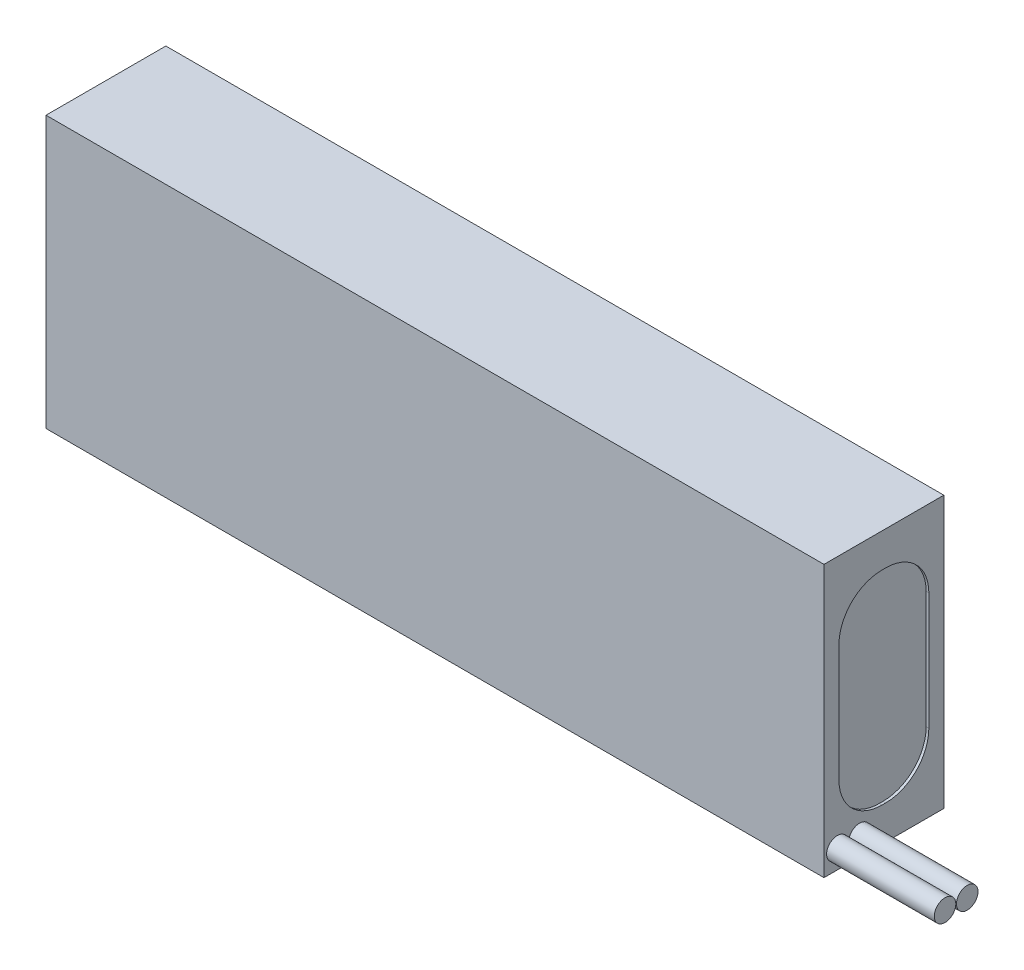
ISO-10303-21;
HEADER;
FILE_DESCRIPTION(('STEP AP214'),'2;1');
FILE_NAME('part.step','',(''),(''),'','','');
FILE_SCHEMA(('AUTOMOTIVE_DESIGN { 1 0 10303 214 1 1 1 1 }'));
ENDSEC;
DATA;
#1=APPLICATION_CONTEXT('core data for automotive mechanical design processes');
#2=APPLICATION_PROTOCOL_DEFINITION('international standard','automotive_design',2000,#1);
#3=PRODUCT_CONTEXT('',#1,'mechanical');
#4=PRODUCT('Part','Part','',(#3));
#5=PRODUCT_RELATED_PRODUCT_CATEGORY('part','',(#4));
#6=PRODUCT_DEFINITION_FORMATION('','',#4);
#7=PRODUCT_DEFINITION_CONTEXT('part definition',#1,'design');
#8=PRODUCT_DEFINITION('design','',#6,#7);
#9=PRODUCT_DEFINITION_SHAPE('','',#8);
#10=(LENGTH_UNIT() NAMED_UNIT(*) SI_UNIT(.MILLI.,.METRE.));
#11=(NAMED_UNIT(*) PLANE_ANGLE_UNIT() SI_UNIT($,.RADIAN.));
#12=(NAMED_UNIT(*) SI_UNIT($,.STERADIAN.) SOLID_ANGLE_UNIT());
#13=UNCERTAINTY_MEASURE_WITH_UNIT(LENGTH_MEASURE(1.E-05),#10,'distance_accuracy_value','');
#14=(GEOMETRIC_REPRESENTATION_CONTEXT(3) GLOBAL_UNCERTAINTY_ASSIGNED_CONTEXT((#13)) GLOBAL_UNIT_ASSIGNED_CONTEXT((#10,
#11,#12)) REPRESENTATION_CONTEXT('',''));
#15=CARTESIAN_POINT('',(0.,0.,0.));
#16=DIRECTION('',(0.,0.,1.));
#17=DIRECTION('',(1.,0.,0.));
#18=AXIS2_PLACEMENT_3D('',#15,#16,#17);
#19=CARTESIAN_POINT('',(69.,28.4,7.26));
#20=DIRECTION('',(1.,0.,0.));
#21=DIRECTION('',(0.,0.,-1.));
#22=AXIS2_PLACEMENT_3D('',#19,#20,#21);
#23=PLANE('',#22);
#24=CARTESIAN_POINT('',(69.,-18.4595652933801,4.77483042519466));
#25=DIRECTION('',(1.,0.,0.));
#26=DIRECTION('',(0.,0.,-1.));
#27=AXIS2_PLACEMENT_3D('',#24,#25,#26);
#28=CIRCLE('',#27,2.00000000000001);
#29=CARTESIAN_POINT('',(69.,-18.4595652933801,2.77483042519466));
#30=VERTEX_POINT('',#29);
#31=EDGE_CURVE('E369',#30,#30,#28,.T.);
#32=ORIENTED_EDGE('',*,*,#31,.F.);
#33=EDGE_LOOP('',(#32));
#34=FACE_BOUND('',#33,.T.);
#35=CARTESIAN_POINT('',(69.,-18.5345539660737,0.651385293316764));
#36=DIRECTION('',(1.,0.,0.));
#37=DIRECTION('',(0.,0.,-1.));
#38=AXIS2_PLACEMENT_3D('',#35,#36,#37);
#39=CIRCLE('',#38,2.00000000000001);
#40=CARTESIAN_POINT('',(69.,-18.5345539660737,-1.34861470668324));
#41=VERTEX_POINT('',#40);
#42=EDGE_CURVE('E201',#41,#41,#39,.T.);
#43=ORIENTED_EDGE('',*,*,#42,.F.);
#44=EDGE_LOOP('',(#43));
#45=FACE_BOUND('',#44,.T.);
#46=CARTESIAN_POINT('',(69.,-7.69999999999999,-3.5225));
#47=DIRECTION('',(1.,0.,0.));
#48=DIRECTION('',(0.,0.,-1.));
#49=AXIS2_PLACEMENT_3D('',#46,#47,#48);
#50=CIRCLE('',#49,8.);
#51=CARTESIAN_POINT('',(69.,-7.69999999999999,4.4775));
#52=VERTEX_POINT('',#51);
#53=CARTESIAN_POINT('',(69.,-15.7,-3.5225));
#54=VERTEX_POINT('',#53);
#55=EDGE_CURVE('E61',#52,#54,#50,.T.);
#56=ORIENTED_EDGE('',*,*,#55,.F.);
#57=DIRECTION('',(0.,-1.,0.));
#58=VECTOR('',#57,1.);
#59=CARTESIAN_POINT('',(69.,14.1,4.4775));
#60=LINE('',#59,#58);
#61=CARTESIAN_POINT('',(69.,14.1,4.4775));
#62=VERTEX_POINT('',#61);
#63=EDGE_CURVE('E252',#62,#52,#60,.T.);
#64=ORIENTED_EDGE('',*,*,#63,.F.);
#65=CARTESIAN_POINT('',(69.,14.1,-3.5225));
#66=DIRECTION('',(1.,0.,0.));
#67=DIRECTION('',(0.,0.,1.));
#68=AXIS2_PLACEMENT_3D('',#65,#66,#67);
#69=CIRCLE('',#68,8.);
#70=CARTESIAN_POINT('',(69.,22.1,-3.5225));
#71=VERTEX_POINT('',#70);
#72=EDGE_CURVE('E290',#71,#62,#69,.T.);
#73=ORIENTED_EDGE('',*,*,#72,.F.);
#74=DIRECTION('',(0.,0.,1.));
#75=VECTOR('',#74,1.);
#76=CARTESIAN_POINT('',(69.,22.1,-4.2175));
#77=LINE('',#76,#75);
#78=CARTESIAN_POINT('',(69.,22.1,-4.2175));
#79=VERTEX_POINT('',#78);
#80=EDGE_CURVE('E287',#79,#71,#77,.T.);
#81=ORIENTED_EDGE('',*,*,#80,.F.);
#82=CARTESIAN_POINT('',(69.,14.1,-4.2175));
#83=DIRECTION('',(1.,0.,0.));
#84=DIRECTION('',(0.,0.,-1.));
#85=AXIS2_PLACEMENT_3D('',#82,#83,#84);
#86=CIRCLE('',#85,8.);
#87=CARTESIAN_POINT('',(69.,14.1,-12.2175));
#88=VERTEX_POINT('',#87);
#89=EDGE_CURVE('E284',#88,#79,#86,.T.);
#90=ORIENTED_EDGE('',*,*,#89,.F.);
#91=DIRECTION('',(0.,1.,0.));
#92=VECTOR('',#91,1.);
#93=CARTESIAN_POINT('',(69.,-7.69999999999999,-12.2175));
#94=LINE('',#93,#92);
#95=CARTESIAN_POINT('',(69.,-7.69999999999999,-12.2175));
#96=VERTEX_POINT('',#95);
#97=EDGE_CURVE('E281',#96,#88,#94,.T.);
#98=ORIENTED_EDGE('',*,*,#97,.F.);
#99=CARTESIAN_POINT('',(69.,-7.69999999999999,-4.2175));
#100=DIRECTION('',(1.,0.,0.));
#101=DIRECTION('',(0.,0.,-1.));
#102=AXIS2_PLACEMENT_3D('',#99,#100,#101);
#103=CIRCLE('',#102,8.);
#104=CARTESIAN_POINT('',(69.,-15.7,-4.2175));
#105=VERTEX_POINT('',#104);
#106=EDGE_CURVE('E278',#105,#96,#103,.T.);
#107=ORIENTED_EDGE('',*,*,#106,.F.);
#108=DIRECTION('',(0.,0.,-1.));
#109=VECTOR('',#108,1.);
#110=CARTESIAN_POINT('',(69.,-15.7,-3.5225));
#111=LINE('',#110,#109);
#112=EDGE_CURVE('E275',#54,#105,#111,.T.);
#113=ORIENTED_EDGE('',*,*,#112,.F.);
#114=EDGE_LOOP('',(#56,#64,#73,#81,#90,#98,#107,#113));
#115=FACE_BOUND('',#114,.T.);
#116=DIRECTION('',(0.,-1.,0.));
#117=VECTOR('',#116,1.);
#118=CARTESIAN_POINT('',(69.,28.4,-15.));
#119=LINE('',#118,#117);
#120=CARTESIAN_POINT('',(69.,28.4,-15.));
#121=VERTEX_POINT('',#120);
#122=CARTESIAN_POINT('',(69.,-22.,-15.));
#123=VERTEX_POINT('',#122);
#124=EDGE_CURVE('E297',#121,#123,#119,.T.);
#125=ORIENTED_EDGE('',*,*,#124,.F.);
#126=DIRECTION('',(0.,0.,-1.));
#127=VECTOR('',#126,1.);
#128=CARTESIAN_POINT('',(69.,28.4,7.26));
#129=LINE('',#128,#127);
#130=CARTESIAN_POINT('',(69.,28.4,7.26));
#131=VERTEX_POINT('',#130);
#132=EDGE_CURVE('E11',#131,#121,#129,.T.);
#133=ORIENTED_EDGE('',*,*,#132,.F.);
#134=DIRECTION('',(0.,-1.,0.));
#135=VECTOR('',#134,1.);
#136=CARTESIAN_POINT('',(69.,28.4,7.26));
#137=LINE('',#136,#135);
#138=CARTESIAN_POINT('',(69.,-22.,7.26));
#139=VERTEX_POINT('',#138);
#140=EDGE_CURVE('E311',#131,#139,#137,.T.);
#141=ORIENTED_EDGE('',*,*,#140,.T.);
#142=DIRECTION('',(0.,0.,-1.));
#143=VECTOR('',#142,1.);
#144=CARTESIAN_POINT('',(69.,-22.,7.26));
#145=LINE('',#144,#143);
#146=EDGE_CURVE('E40',#139,#123,#145,.T.);
#147=ORIENTED_EDGE('',*,*,#146,.T.);
#148=EDGE_LOOP('',(#125,#133,#141,#147));
#149=FACE_BOUND('',#148,.T.);
#150=ADVANCED_FACE('F37',(#34,#45,#115,#149),#23,.T.);
#151=CARTESIAN_POINT('',(-75.5,28.4,7.26));
#152=DIRECTION('',(0.,1.,0.));
#153=DIRECTION('',(0.,0.,1.));
#154=AXIS2_PLACEMENT_3D('',#151,#152,#153);
#155=PLANE('',#154);
#156=DIRECTION('',(1.,0.,0.));
#157=VECTOR('',#156,1.);
#158=CARTESIAN_POINT('',(-75.5,28.4,-15.));
#159=LINE('',#158,#157);
#160=CARTESIAN_POINT('',(-75.5,28.4,-15.));
#161=VERTEX_POINT('',#160);
#162=EDGE_CURVE('E315',#161,#121,#159,.T.);
#163=ORIENTED_EDGE('',*,*,#162,.F.);
#164=DIRECTION('',(0.,0.,-1.));
#165=VECTOR('',#164,1.);
#166=CARTESIAN_POINT('',(-75.5,28.4,7.26));
#167=LINE('',#166,#165);
#168=CARTESIAN_POINT('',(-75.5,28.4,7.26));
#169=VERTEX_POINT('',#168);
#170=EDGE_CURVE('E45',#169,#161,#167,.T.);
#171=ORIENTED_EDGE('',*,*,#170,.F.);
#172=DIRECTION('',(1.,0.,0.));
#173=VECTOR('',#172,1.);
#174=CARTESIAN_POINT('',(-75.5,28.4,7.26));
#175=LINE('',#174,#173);
#176=EDGE_CURVE('E321',#169,#131,#175,.T.);
#177=ORIENTED_EDGE('',*,*,#176,.T.);
#178=ORIENTED_EDGE('',*,*,#132,.T.);
#179=EDGE_LOOP('',(#163,#171,#177,#178));
#180=FACE_BOUND('',#179,.T.);
#181=ADVANCED_FACE('F347',(#180),#155,.T.);
#182=CARTESIAN_POINT('',(-75.5,-22.,7.26));
#183=DIRECTION('',(-1.,0.,0.));
#184=DIRECTION('',(0.,0.,1.));
#185=AXIS2_PLACEMENT_3D('',#182,#183,#184);
#186=PLANE('',#185);
#187=CARTESIAN_POINT('',(-75.5,-7.70000000000001,-4.2175));
#188=DIRECTION('',(-1.,0.,0.));
#189=DIRECTION('',(0.,0.,1.));
#190=AXIS2_PLACEMENT_3D('',#187,#188,#189);
#191=CIRCLE('',#190,8.);
#192=CARTESIAN_POINT('',(-75.5,-7.70000000000001,-12.2175));
#193=VERTEX_POINT('',#192);
#194=CARTESIAN_POINT('',(-75.5,-15.7,-4.2175));
#195=VERTEX_POINT('',#194);
#196=EDGE_CURVE('E53',#193,#195,#191,.T.);
#197=ORIENTED_EDGE('',*,*,#196,.F.);
#198=DIRECTION('',(0.,-1.,0.));
#199=VECTOR('',#198,1.);
#200=CARTESIAN_POINT('',(-75.5,14.1,-12.2175));
#201=LINE('',#200,#199);
#202=CARTESIAN_POINT('',(-75.5,14.1,-12.2175));
#203=VERTEX_POINT('',#202);
#204=EDGE_CURVE('E195',#203,#193,#201,.T.);
#205=ORIENTED_EDGE('',*,*,#204,.F.);
#206=CARTESIAN_POINT('',(-75.5,14.1,-4.2175));
#207=DIRECTION('',(-1.,0.,0.));
#208=DIRECTION('',(0.,0.,1.));
#209=AXIS2_PLACEMENT_3D('',#206,#207,#208);
#210=CIRCLE('',#209,8.);
#211=CARTESIAN_POINT('',(-75.5,22.1,-4.2175));
#212=VERTEX_POINT('',#211);
#213=EDGE_CURVE('E198',#212,#203,#210,.T.);
#214=ORIENTED_EDGE('',*,*,#213,.F.);
#215=DIRECTION('',(0.,0.,-1.));
#216=VECTOR('',#215,1.);
#217=CARTESIAN_POINT('',(-75.5,22.1,-3.5225));
#218=LINE('',#217,#216);
#219=CARTESIAN_POINT('',(-75.5,22.1,-3.5225));
#220=VERTEX_POINT('',#219);
#221=EDGE_CURVE('E230',#220,#212,#218,.T.);
#222=ORIENTED_EDGE('',*,*,#221,.F.);
#223=CARTESIAN_POINT('',(-75.5,14.1,-3.5225));
#224=DIRECTION('',(-1.,0.,0.));
#225=DIRECTION('',(0.,0.,-1.));
#226=AXIS2_PLACEMENT_3D('',#223,#224,#225);
#227=CIRCLE('',#226,8.);
#228=CARTESIAN_POINT('',(-75.5,14.1,4.4775));
#229=VERTEX_POINT('',#228);
#230=EDGE_CURVE('E227',#229,#220,#227,.T.);
#231=ORIENTED_EDGE('',*,*,#230,.F.);
#232=DIRECTION('',(0.,1.,0.));
#233=VECTOR('',#232,1.);
#234=CARTESIAN_POINT('',(-75.5,-7.70000000000001,4.4775));
#235=LINE('',#234,#233);
#236=CARTESIAN_POINT('',(-75.5,-7.70000000000001,4.4775));
#237=VERTEX_POINT('',#236);
#238=EDGE_CURVE('E224',#237,#229,#235,.T.);
#239=ORIENTED_EDGE('',*,*,#238,.F.);
#240=CARTESIAN_POINT('',(-75.5,-7.70000000000001,-3.5225));
#241=DIRECTION('',(-1.,0.,0.));
#242=DIRECTION('',(0.,0.,1.));
#243=AXIS2_PLACEMENT_3D('',#240,#241,#242);
#244=CIRCLE('',#243,8.);
#245=CARTESIAN_POINT('',(-75.5,-15.7,-3.5225));
#246=VERTEX_POINT('',#245);
#247=EDGE_CURVE('E221',#246,#237,#244,.T.);
#248=ORIENTED_EDGE('',*,*,#247,.F.);
#249=DIRECTION('',(0.,0.,1.));
#250=VECTOR('',#249,1.);
#251=CARTESIAN_POINT('',(-75.5,-15.7,-4.2175));
#252=LINE('',#251,#250);
#253=EDGE_CURVE('E218',#195,#246,#252,.T.);
#254=ORIENTED_EDGE('',*,*,#253,.F.);
#255=EDGE_LOOP('',(#197,#205,#214,#222,#231,#239,#248,#254));
#256=FACE_BOUND('',#255,.T.);
#257=DIRECTION('',(0.,1.,0.));
#258=VECTOR('',#257,1.);
#259=CARTESIAN_POINT('',(-75.5,-22.,-15.));
#260=LINE('',#259,#258);
#261=CARTESIAN_POINT('',(-75.5,-22.,-15.));
#262=VERTEX_POINT('',#261);
#263=EDGE_CURVE('E329',#262,#161,#260,.T.);
#264=ORIENTED_EDGE('',*,*,#263,.F.);
#265=DIRECTION('',(0.,0.,-1.));
#266=VECTOR('',#265,1.);
#267=CARTESIAN_POINT('',(-75.5,-22.,7.26));
#268=LINE('',#267,#266);
#269=CARTESIAN_POINT('',(-75.5,-22.,7.26));
#270=VERTEX_POINT('',#269);
#271=EDGE_CURVE('E334',#270,#262,#268,.T.);
#272=ORIENTED_EDGE('',*,*,#271,.F.);
#273=DIRECTION('',(0.,1.,0.));
#274=VECTOR('',#273,1.);
#275=CARTESIAN_POINT('',(-75.5,-22.,7.26));
#276=LINE('',#275,#274);
#277=EDGE_CURVE('E318',#270,#169,#276,.T.);
#278=ORIENTED_EDGE('',*,*,#277,.T.);
#279=ORIENTED_EDGE('',*,*,#170,.T.);
#280=EDGE_LOOP('',(#264,#272,#278,#279));
#281=FACE_BOUND('',#280,.T.);
#282=ADVANCED_FACE('F353',(#256,#281),#186,.T.);
#283=CARTESIAN_POINT('',(69.,-22.,7.26));
#284=DIRECTION('',(0.,-1.,0.));
#285=DIRECTION('',(0.,0.,-1.));
#286=AXIS2_PLACEMENT_3D('',#283,#284,#285);
#287=PLANE('',#286);
#288=DIRECTION('',(-1.,0.,0.));
#289=VECTOR('',#288,1.);
#290=CARTESIAN_POINT('',(69.,-22.,-15.));
#291=LINE('',#290,#289);
#292=EDGE_CURVE('E326',#123,#262,#291,.T.);
#293=ORIENTED_EDGE('',*,*,#292,.F.);
#294=ORIENTED_EDGE('',*,*,#146,.F.);
#295=DIRECTION('',(-1.,0.,0.));
#296=VECTOR('',#295,1.);
#297=CARTESIAN_POINT('',(69.,-22.,7.26));
#298=LINE('',#297,#296);
#299=EDGE_CURVE('E314',#139,#270,#298,.T.);
#300=ORIENTED_EDGE('',*,*,#299,.T.);
#301=ORIENTED_EDGE('',*,*,#271,.T.);
#302=EDGE_LOOP('',(#293,#294,#300,#301));
#303=FACE_BOUND('',#302,.T.);
#304=ADVANCED_FACE('F342',(#303),#287,.T.);
#305=CARTESIAN_POINT('',(0.,0.,7.26));
#306=DIRECTION('',(0.,0.,-1.));
#307=DIRECTION('',(-1.,0.,0.));
#308=AXIS2_PLACEMENT_3D('',#305,#306,#307);
#309=PLANE('',#308);
#310=ORIENTED_EDGE('',*,*,#140,.F.);
#311=ORIENTED_EDGE('',*,*,#176,.F.);
#312=ORIENTED_EDGE('',*,*,#277,.F.);
#313=ORIENTED_EDGE('',*,*,#299,.F.);
#314=EDGE_LOOP('',(#310,#311,#312,#313));
#315=FACE_BOUND('',#314,.T.);
#316=ADVANCED_FACE('F350',(#315),#309,.F.);
#317=CARTESIAN_POINT('',(0.,0.,-15.));
#318=DIRECTION('',(0.,0.,-1.));
#319=DIRECTION('',(-1.,0.,0.));
#320=AXIS2_PLACEMENT_3D('',#317,#318,#319);
#321=PLANE('',#320);
#322=ORIENTED_EDGE('',*,*,#124,.T.);
#323=ORIENTED_EDGE('',*,*,#292,.T.);
#324=ORIENTED_EDGE('',*,*,#263,.T.);
#325=ORIENTED_EDGE('',*,*,#162,.T.);
#326=EDGE_LOOP('',(#322,#323,#324,#325));
#327=FACE_BOUND('',#326,.T.);
#328=ADVANCED_FACE('F344',(#327),#321,.T.);
#329=CARTESIAN_POINT('',(68.5,-7.69999999999999,-3.5225));
#330=DIRECTION('',(1.,0.,0.));
#331=DIRECTION('',(0.,0.,-1.));
#332=AXIS2_PLACEMENT_3D('',#329,#330,#331);
#333=CYLINDRICAL_SURFACE('',#332,8.);
#334=ORIENTED_EDGE('',*,*,#55,.T.);
#335=DIRECTION('',(1.,0.,0.));
#336=VECTOR('',#335,1.);
#337=CARTESIAN_POINT('',(68.5,-15.7,-3.5225));
#338=LINE('',#337,#336);
#339=CARTESIAN_POINT('',(68.5,-15.7,-3.5225));
#340=VERTEX_POINT('',#339);
#341=EDGE_CURVE('E273',#340,#54,#338,.T.);
#342=ORIENTED_EDGE('',*,*,#341,.F.);
#343=CARTESIAN_POINT('',(68.5,-7.69999999999999,-3.5225));
#344=DIRECTION('',(1.,0.,0.));
#345=DIRECTION('',(0.,0.,-1.));
#346=AXIS2_PLACEMENT_3D('',#343,#344,#345);
#347=CIRCLE('',#346,8.);
#348=CARTESIAN_POINT('',(68.5,-7.69999999999999,4.4775));
#349=VERTEX_POINT('',#348);
#350=EDGE_CURVE('E248',#349,#340,#347,.T.);
#351=ORIENTED_EDGE('',*,*,#350,.F.);
#352=DIRECTION('',(1.,0.,0.));
#353=VECTOR('',#352,1.);
#354=CARTESIAN_POINT('',(68.5,-7.69999999999999,4.4775));
#355=LINE('',#354,#353);
#356=EDGE_CURVE('E295',#349,#52,#355,.T.);
#357=ORIENTED_EDGE('',*,*,#356,.T.);
#358=EDGE_LOOP('',(#334,#342,#351,#357));
#359=FACE_BOUND('',#358,.T.);
#360=ADVANCED_FACE('F383',(#359),#333,.F.);
#361=CARTESIAN_POINT('',(68.5,14.1,4.4775));
#362=DIRECTION('',(0.,0.,1.));
#363=DIRECTION('',(1.,0.,0.));
#364=AXIS2_PLACEMENT_3D('',#361,#362,#363);
#365=PLANE('',#364);
#366=ORIENTED_EDGE('',*,*,#63,.T.);
#367=ORIENTED_EDGE('',*,*,#356,.F.);
#368=DIRECTION('',(0.,-1.,0.));
#369=VECTOR('',#368,1.);
#370=CARTESIAN_POINT('',(68.5,14.1,4.4775));
#371=LINE('',#370,#369);
#372=CARTESIAN_POINT('',(68.5,14.1,4.4775));
#373=VERTEX_POINT('',#372);
#374=EDGE_CURVE('E270',#373,#349,#371,.T.);
#375=ORIENTED_EDGE('',*,*,#374,.F.);
#376=DIRECTION('',(1.,0.,0.));
#377=VECTOR('',#376,1.);
#378=CARTESIAN_POINT('',(68.5,14.1,4.4775));
#379=LINE('',#378,#377);
#380=EDGE_CURVE('E298',#373,#62,#379,.T.);
#381=ORIENTED_EDGE('',*,*,#380,.T.);
#382=EDGE_LOOP('',(#366,#367,#375,#381));
#383=FACE_BOUND('',#382,.T.);
#384=ADVANCED_FACE('F389',(#383),#365,.F.);
#385=CARTESIAN_POINT('',(68.5,14.1,-3.5225));
#386=DIRECTION('',(1.,0.,0.));
#387=DIRECTION('',(0.,0.,-1.));
#388=AXIS2_PLACEMENT_3D('',#385,#386,#387);
#389=CYLINDRICAL_SURFACE('',#388,8.);
#390=ORIENTED_EDGE('',*,*,#72,.T.);
#391=ORIENTED_EDGE('',*,*,#380,.F.);
#392=CARTESIAN_POINT('',(68.5,14.1,-3.5225));
#393=DIRECTION('',(1.,0.,0.));
#394=DIRECTION('',(0.,0.,1.));
#395=AXIS2_PLACEMENT_3D('',#392,#393,#394);
#396=CIRCLE('',#395,8.);
#397=CARTESIAN_POINT('',(68.5,22.1,-3.5225));
#398=VERTEX_POINT('',#397);
#399=EDGE_CURVE('E267',#398,#373,#396,.T.);
#400=ORIENTED_EDGE('',*,*,#399,.F.);
#401=DIRECTION('',(1.,0.,0.));
#402=VECTOR('',#401,1.);
#403=CARTESIAN_POINT('',(68.5,22.1,-3.5225));
#404=LINE('',#403,#402);
#405=EDGE_CURVE('E300',#398,#71,#404,.T.);
#406=ORIENTED_EDGE('',*,*,#405,.T.);
#407=EDGE_LOOP('',(#390,#391,#400,#406));
#408=FACE_BOUND('',#407,.T.);
#409=ADVANCED_FACE('F391',(#408),#389,.F.);
#410=CARTESIAN_POINT('',(68.5,22.1,-4.2175));
#411=DIRECTION('',(0.,1.,0.));
#412=DIRECTION('',(0.,0.,1.));
#413=AXIS2_PLACEMENT_3D('',#410,#411,#412);
#414=PLANE('',#413);
#415=ORIENTED_EDGE('',*,*,#80,.T.);
#416=ORIENTED_EDGE('',*,*,#405,.F.);
#417=DIRECTION('',(0.,0.,1.));
#418=VECTOR('',#417,1.);
#419=CARTESIAN_POINT('',(68.5,22.1,-4.2175));
#420=LINE('',#419,#418);
#421=CARTESIAN_POINT('',(68.5,22.1,-4.2175));
#422=VERTEX_POINT('',#421);
#423=EDGE_CURVE('E264',#422,#398,#420,.T.);
#424=ORIENTED_EDGE('',*,*,#423,.F.);
#425=DIRECTION('',(1.,0.,0.));
#426=VECTOR('',#425,1.);
#427=CARTESIAN_POINT('',(68.5,22.1,-4.2175));
#428=LINE('',#427,#426);
#429=EDGE_CURVE('E302',#422,#79,#428,.T.);
#430=ORIENTED_EDGE('',*,*,#429,.T.);
#431=EDGE_LOOP('',(#415,#416,#424,#430));
#432=FACE_BOUND('',#431,.T.);
#433=ADVANCED_FACE('F395',(#432),#414,.F.);
#434=CARTESIAN_POINT('',(68.5,14.1,-4.2175));
#435=DIRECTION('',(1.,0.,0.));
#436=DIRECTION('',(0.,0.,-1.));
#437=AXIS2_PLACEMENT_3D('',#434,#435,#436);
#438=CYLINDRICAL_SURFACE('',#437,8.);
#439=ORIENTED_EDGE('',*,*,#89,.T.);
#440=ORIENTED_EDGE('',*,*,#429,.F.);
#441=CARTESIAN_POINT('',(68.5,14.1,-4.2175));
#442=DIRECTION('',(1.,0.,0.));
#443=DIRECTION('',(0.,0.,-1.));
#444=AXIS2_PLACEMENT_3D('',#441,#442,#443);
#445=CIRCLE('',#444,8.);
#446=CARTESIAN_POINT('',(68.5,14.1,-12.2175));
#447=VERTEX_POINT('',#446);
#448=EDGE_CURVE('E261',#447,#422,#445,.T.);
#449=ORIENTED_EDGE('',*,*,#448,.F.);
#450=DIRECTION('',(1.,0.,0.));
#451=VECTOR('',#450,1.);
#452=CARTESIAN_POINT('',(68.5,14.1,-12.2175));
#453=LINE('',#452,#451);
#454=EDGE_CURVE('E304',#447,#88,#453,.T.);
#455=ORIENTED_EDGE('',*,*,#454,.T.);
#456=EDGE_LOOP('',(#439,#440,#449,#455));
#457=FACE_BOUND('',#456,.T.);
#458=ADVANCED_FACE('F399',(#457),#438,.F.);
#459=CARTESIAN_POINT('',(68.5,-7.69999999999999,-12.2175));
#460=DIRECTION('',(0.,0.,-1.));
#461=DIRECTION('',(-1.,0.,0.));
#462=AXIS2_PLACEMENT_3D('',#459,#460,#461);
#463=PLANE('',#462);
#464=ORIENTED_EDGE('',*,*,#97,.T.);
#465=ORIENTED_EDGE('',*,*,#454,.F.);
#466=DIRECTION('',(0.,1.,0.));
#467=VECTOR('',#466,1.);
#468=CARTESIAN_POINT('',(68.5,-7.69999999999999,-12.2175));
#469=LINE('',#468,#467);
#470=CARTESIAN_POINT('',(68.5,-7.69999999999999,-12.2175));
#471=VERTEX_POINT('',#470);
#472=EDGE_CURVE('E258',#471,#447,#469,.T.);
#473=ORIENTED_EDGE('',*,*,#472,.F.);
#474=DIRECTION('',(1.,0.,0.));
#475=VECTOR('',#474,1.);
#476=CARTESIAN_POINT('',(68.5,-7.69999999999999,-12.2175));
#477=LINE('',#476,#475);
#478=EDGE_CURVE('E306',#471,#96,#477,.T.);
#479=ORIENTED_EDGE('',*,*,#478,.T.);
#480=EDGE_LOOP('',(#464,#465,#473,#479));
#481=FACE_BOUND('',#480,.T.);
#482=ADVANCED_FACE('F402',(#481),#463,.F.);
#483=CARTESIAN_POINT('',(68.5,-7.69999999999999,-4.2175));
#484=DIRECTION('',(1.,0.,0.));
#485=DIRECTION('',(0.,0.,-1.));
#486=AXIS2_PLACEMENT_3D('',#483,#484,#485);
#487=CYLINDRICAL_SURFACE('',#486,8.);
#488=ORIENTED_EDGE('',*,*,#106,.T.);
#489=ORIENTED_EDGE('',*,*,#478,.F.);
#490=CARTESIAN_POINT('',(68.5,-7.69999999999999,-4.2175));
#491=DIRECTION('',(1.,0.,0.));
#492=DIRECTION('',(0.,0.,-1.));
#493=AXIS2_PLACEMENT_3D('',#490,#491,#492);
#494=CIRCLE('',#493,8.);
#495=CARTESIAN_POINT('',(68.5,-15.7,-4.2175));
#496=VERTEX_POINT('',#495);
#497=EDGE_CURVE('E255',#496,#471,#494,.T.);
#498=ORIENTED_EDGE('',*,*,#497,.F.);
#499=DIRECTION('',(1.,0.,0.));
#500=VECTOR('',#499,1.);
#501=CARTESIAN_POINT('',(68.5,-15.7,-4.2175));
#502=LINE('',#501,#500);
#503=EDGE_CURVE('E308',#496,#105,#502,.T.);
#504=ORIENTED_EDGE('',*,*,#503,.T.);
#505=EDGE_LOOP('',(#488,#489,#498,#504));
#506=FACE_BOUND('',#505,.T.);
#507=ADVANCED_FACE('F404',(#506),#487,.F.);
#508=CARTESIAN_POINT('',(68.5,-15.7,-3.5225));
#509=DIRECTION('',(0.,-1.,0.));
#510=DIRECTION('',(0.,0.,-1.));
#511=AXIS2_PLACEMENT_3D('',#508,#509,#510);
#512=PLANE('',#511);
#513=ORIENTED_EDGE('',*,*,#112,.T.);
#514=ORIENTED_EDGE('',*,*,#503,.F.);
#515=DIRECTION('',(0.,0.,-1.));
#516=VECTOR('',#515,1.);
#517=CARTESIAN_POINT('',(68.5,-15.7,-3.5225));
#518=LINE('',#517,#516);
#519=EDGE_CURVE('E251',#340,#496,#518,.T.);
#520=ORIENTED_EDGE('',*,*,#519,.F.);
#521=ORIENTED_EDGE('',*,*,#341,.T.);
#522=EDGE_LOOP('',(#513,#514,#520,#521));
#523=FACE_BOUND('',#522,.T.);
#524=ADVANCED_FACE('F379',(#523),#512,.F.);
#525=CARTESIAN_POINT('',(68.5,-7.69999999999999,-3.5225));
#526=DIRECTION('',(1.,0.,0.));
#527=DIRECTION('',(0.,0.,-1.));
#528=AXIS2_PLACEMENT_3D('',#525,#526,#527);
#529=PLANE('',#528);
#530=ORIENTED_EDGE('',*,*,#350,.T.);
#531=ORIENTED_EDGE('',*,*,#519,.T.);
#532=ORIENTED_EDGE('',*,*,#497,.T.);
#533=ORIENTED_EDGE('',*,*,#472,.T.);
#534=ORIENTED_EDGE('',*,*,#448,.T.);
#535=ORIENTED_EDGE('',*,*,#423,.T.);
#536=ORIENTED_EDGE('',*,*,#399,.T.);
#537=ORIENTED_EDGE('',*,*,#374,.T.);
#538=EDGE_LOOP('',(#530,#531,#532,#533,#534,#535,#536,#537));
#539=FACE_BOUND('',#538,.T.);
#540=ADVANCED_FACE('F386',(#539),#529,.T.);
#541=CARTESIAN_POINT('',(-75.,-7.70000000000001,-4.2175));
#542=DIRECTION('',(-1.,0.,0.));
#543=DIRECTION('',(0.,0.,1.));
#544=AXIS2_PLACEMENT_3D('',#541,#542,#543);
#545=CYLINDRICAL_SURFACE('',#544,8.);
#546=ORIENTED_EDGE('',*,*,#196,.T.);
#547=DIRECTION('',(-1.,0.,0.));
#548=VECTOR('',#547,1.);
#549=CARTESIAN_POINT('',(-75.,-15.7,-4.2175));
#550=LINE('',#549,#548);
#551=CARTESIAN_POINT('',(-75.,-15.7,-4.2175));
#552=VERTEX_POINT('',#551);
#553=EDGE_CURVE('E172',#552,#195,#550,.T.);
#554=ORIENTED_EDGE('',*,*,#553,.F.);
#555=CARTESIAN_POINT('',(-75.,-7.70000000000001,-4.2175));
#556=DIRECTION('',(-1.,0.,0.));
#557=DIRECTION('',(0.,0.,1.));
#558=AXIS2_PLACEMENT_3D('',#555,#556,#557);
#559=CIRCLE('',#558,8.);
#560=CARTESIAN_POINT('',(-75.,-7.70000000000001,-12.2175));
#561=VERTEX_POINT('',#560);
#562=EDGE_CURVE('E176',#561,#552,#559,.T.);
#563=ORIENTED_EDGE('',*,*,#562,.F.);
#564=DIRECTION('',(-1.,0.,0.));
#565=VECTOR('',#564,1.);
#566=CARTESIAN_POINT('',(-75.,-7.70000000000001,-12.2175));
#567=LINE('',#566,#565);
#568=EDGE_CURVE('E235',#561,#193,#567,.T.);
#569=ORIENTED_EDGE('',*,*,#568,.T.);
#570=EDGE_LOOP('',(#546,#554,#563,#569));
#571=FACE_BOUND('',#570,.T.);
#572=ADVANCED_FACE('F174',(#571),#545,.F.);
#573=CARTESIAN_POINT('',(-75.,14.1,-12.2175));
#574=DIRECTION('',(0.,0.,-1.));
#575=DIRECTION('',(-1.,0.,0.));
#576=AXIS2_PLACEMENT_3D('',#573,#574,#575);
#577=PLANE('',#576);
#578=ORIENTED_EDGE('',*,*,#204,.T.);
#579=ORIENTED_EDGE('',*,*,#568,.F.);
#580=DIRECTION('',(0.,-1.,0.));
#581=VECTOR('',#580,1.);
#582=CARTESIAN_POINT('',(-75.,14.1,-12.2175));
#583=LINE('',#582,#581);
#584=CARTESIAN_POINT('',(-75.,14.1,-12.2175));
#585=VERTEX_POINT('',#584);
#586=EDGE_CURVE('E182',#585,#561,#583,.T.);
#587=ORIENTED_EDGE('',*,*,#586,.F.);
#588=DIRECTION('',(-1.,0.,0.));
#589=VECTOR('',#588,1.);
#590=CARTESIAN_POINT('',(-75.,14.1,-12.2175));
#591=LINE('',#590,#589);
#592=EDGE_CURVE('E237',#585,#203,#591,.T.);
#593=ORIENTED_EDGE('',*,*,#592,.T.);
#594=EDGE_LOOP('',(#578,#579,#587,#593));
#595=FACE_BOUND('',#594,.T.);
#596=ADVANCED_FACE('F490',(#595),#577,.F.);
#597=CARTESIAN_POINT('',(-75.,14.1,-4.2175));
#598=DIRECTION('',(-1.,0.,0.));
#599=DIRECTION('',(0.,0.,1.));
#600=AXIS2_PLACEMENT_3D('',#597,#598,#599);
#601=CYLINDRICAL_SURFACE('',#600,8.);
#602=ORIENTED_EDGE('',*,*,#213,.T.);
#603=ORIENTED_EDGE('',*,*,#592,.F.);
#604=CARTESIAN_POINT('',(-75.,14.1,-4.2175));
#605=DIRECTION('',(-1.,0.,0.));
#606=DIRECTION('',(0.,0.,1.));
#607=AXIS2_PLACEMENT_3D('',#604,#605,#606);
#608=CIRCLE('',#607,8.);
#609=CARTESIAN_POINT('',(-75.,22.1,-4.2175));
#610=VERTEX_POINT('',#609);
#611=EDGE_CURVE('E214',#610,#585,#608,.T.);
#612=ORIENTED_EDGE('',*,*,#611,.F.);
#613=DIRECTION('',(-1.,0.,0.));
#614=VECTOR('',#613,1.);
#615=CARTESIAN_POINT('',(-75.,22.1,-4.2175));
#616=LINE('',#615,#614);
#617=EDGE_CURVE('E239',#610,#212,#616,.T.);
#618=ORIENTED_EDGE('',*,*,#617,.T.);
#619=EDGE_LOOP('',(#602,#603,#612,#618));
#620=FACE_BOUND('',#619,.T.);
#621=ADVANCED_FACE('F499',(#620),#601,.F.);
#622=CARTESIAN_POINT('',(-75.,22.1,-3.5225));
#623=DIRECTION('',(0.,1.,0.));
#624=DIRECTION('',(0.,0.,1.));
#625=AXIS2_PLACEMENT_3D('',#622,#623,#624);
#626=PLANE('',#625);
#627=ORIENTED_EDGE('',*,*,#221,.T.);
#628=ORIENTED_EDGE('',*,*,#617,.F.);
#629=DIRECTION('',(0.,0.,-1.));
#630=VECTOR('',#629,1.);
#631=CARTESIAN_POINT('',(-75.,22.1,-3.5225));
#632=LINE('',#631,#630);
#633=CARTESIAN_POINT('',(-75.,22.1,-3.5225));
#634=VERTEX_POINT('',#633);
#635=EDGE_CURVE('E211',#634,#610,#632,.T.);
#636=ORIENTED_EDGE('',*,*,#635,.F.);
#637=DIRECTION('',(-1.,0.,0.));
#638=VECTOR('',#637,1.);
#639=CARTESIAN_POINT('',(-75.,22.1,-3.5225));
#640=LINE('',#639,#638);
#641=EDGE_CURVE('E241',#634,#220,#640,.T.);
#642=ORIENTED_EDGE('',*,*,#641,.T.);
#643=EDGE_LOOP('',(#627,#628,#636,#642));
#644=FACE_BOUND('',#643,.T.);
#645=ADVANCED_FACE('F509',(#644),#626,.F.);
#646=CARTESIAN_POINT('',(-75.,14.1,-3.5225));
#647=DIRECTION('',(-1.,0.,0.));
#648=DIRECTION('',(0.,0.,1.));
#649=AXIS2_PLACEMENT_3D('',#646,#647,#648);
#650=CYLINDRICAL_SURFACE('',#649,8.);
#651=ORIENTED_EDGE('',*,*,#230,.T.);
#652=ORIENTED_EDGE('',*,*,#641,.F.);
#653=CARTESIAN_POINT('',(-75.,14.1,-3.5225));
#654=DIRECTION('',(-1.,0.,0.));
#655=DIRECTION('',(0.,0.,-1.));
#656=AXIS2_PLACEMENT_3D('',#653,#654,#655);
#657=CIRCLE('',#656,8.);
#658=CARTESIAN_POINT('',(-75.,14.1,4.4775));
#659=VERTEX_POINT('',#658);
#660=EDGE_CURVE('E208',#659,#634,#657,.T.);
#661=ORIENTED_EDGE('',*,*,#660,.F.);
#662=DIRECTION('',(-1.,0.,0.));
#663=VECTOR('',#662,1.);
#664=CARTESIAN_POINT('',(-75.,14.1,4.4775));
#665=LINE('',#664,#663);
#666=EDGE_CURVE('E243',#659,#229,#665,.T.);
#667=ORIENTED_EDGE('',*,*,#666,.T.);
#668=EDGE_LOOP('',(#651,#652,#661,#667));
#669=FACE_BOUND('',#668,.T.);
#670=ADVANCED_FACE('F519',(#669),#650,.F.);
#671=CARTESIAN_POINT('',(-75.,-7.70000000000001,4.4775));
#672=DIRECTION('',(0.,0.,1.));
#673=DIRECTION('',(1.,0.,0.));
#674=AXIS2_PLACEMENT_3D('',#671,#672,#673);
#675=PLANE('',#674);
#676=ORIENTED_EDGE('',*,*,#238,.T.);
#677=ORIENTED_EDGE('',*,*,#666,.F.);
#678=DIRECTION('',(0.,1.,0.));
#679=VECTOR('',#678,1.);
#680=CARTESIAN_POINT('',(-75.,-7.70000000000001,4.4775));
#681=LINE('',#680,#679);
#682=CARTESIAN_POINT('',(-75.,-7.70000000000001,4.4775));
#683=VERTEX_POINT('',#682);
#684=EDGE_CURVE('E205',#683,#659,#681,.T.);
#685=ORIENTED_EDGE('',*,*,#684,.F.);
#686=DIRECTION('',(-1.,0.,0.));
#687=VECTOR('',#686,1.);
#688=CARTESIAN_POINT('',(-75.,-7.70000000000001,4.4775));
#689=LINE('',#688,#687);
#690=EDGE_CURVE('E245',#683,#237,#689,.T.);
#691=ORIENTED_EDGE('',*,*,#690,.T.);
#692=EDGE_LOOP('',(#676,#677,#685,#691));
#693=FACE_BOUND('',#692,.T.);
#694=ADVANCED_FACE('F529',(#693),#675,.F.);
#695=CARTESIAN_POINT('',(-75.,-7.70000000000001,-3.5225));
#696=DIRECTION('',(-1.,0.,0.));
#697=DIRECTION('',(0.,0.,1.));
#698=AXIS2_PLACEMENT_3D('',#695,#696,#697);
#699=CYLINDRICAL_SURFACE('',#698,8.);
#700=ORIENTED_EDGE('',*,*,#247,.T.);
#701=ORIENTED_EDGE('',*,*,#690,.F.);
#702=CARTESIAN_POINT('',(-75.,-7.70000000000001,-3.5225));
#703=DIRECTION('',(-1.,0.,0.));
#704=DIRECTION('',(0.,0.,1.));
#705=AXIS2_PLACEMENT_3D('',#702,#703,#704);
#706=CIRCLE('',#705,8.);
#707=CARTESIAN_POINT('',(-75.,-15.7,-3.5225));
#708=VERTEX_POINT('',#707);
#709=EDGE_CURVE('E190',#708,#683,#706,.T.);
#710=ORIENTED_EDGE('',*,*,#709,.F.);
#711=DIRECTION('',(-1.,0.,0.));
#712=VECTOR('',#711,1.);
#713=CARTESIAN_POINT('',(-75.,-15.7,-3.5225));
#714=LINE('',#713,#712);
#715=EDGE_CURVE('E181',#708,#246,#714,.T.);
#716=ORIENTED_EDGE('',*,*,#715,.T.);
#717=EDGE_LOOP('',(#700,#701,#710,#716));
#718=FACE_BOUND('',#717,.T.);
#719=ADVANCED_FACE('F539',(#718),#699,.F.);
#720=CARTESIAN_POINT('',(-75.,-15.7,-4.2175));
#721=DIRECTION('',(0.,-1.,0.));
#722=DIRECTION('',(0.,0.,-1.));
#723=AXIS2_PLACEMENT_3D('',#720,#721,#722);
#724=PLANE('',#723);
#725=ORIENTED_EDGE('',*,*,#253,.T.);
#726=ORIENTED_EDGE('',*,*,#715,.F.);
#727=DIRECTION('',(0.,0.,1.));
#728=VECTOR('',#727,1.);
#729=CARTESIAN_POINT('',(-75.,-15.7,-4.2175));
#730=LINE('',#729,#728);
#731=EDGE_CURVE('E185',#552,#708,#730,.T.);
#732=ORIENTED_EDGE('',*,*,#731,.F.);
#733=ORIENTED_EDGE('',*,*,#553,.T.);
#734=EDGE_LOOP('',(#725,#726,#732,#733));
#735=FACE_BOUND('',#734,.T.);
#736=ADVANCED_FACE('F186',(#735),#724,.F.);
#737=CARTESIAN_POINT('',(-75.,-7.70000000000001,-4.2175));
#738=DIRECTION('',(-1.,0.,0.));
#739=DIRECTION('',(0.,0.,1.));
#740=AXIS2_PLACEMENT_3D('',#737,#738,#739);
#741=PLANE('',#740);
#742=ORIENTED_EDGE('',*,*,#562,.T.);
#743=ORIENTED_EDGE('',*,*,#731,.T.);
#744=ORIENTED_EDGE('',*,*,#709,.T.);
#745=ORIENTED_EDGE('',*,*,#684,.T.);
#746=ORIENTED_EDGE('',*,*,#660,.T.);
#747=ORIENTED_EDGE('',*,*,#635,.T.);
#748=ORIENTED_EDGE('',*,*,#611,.T.);
#749=ORIENTED_EDGE('',*,*,#586,.T.);
#750=EDGE_LOOP('',(#742,#743,#744,#745,#746,#747,#748,#749));
#751=FACE_BOUND('',#750,.T.);
#752=ADVANCED_FACE('F192',(#751),#741,.T.);
#753=CARTESIAN_POINT('',(89.,-18.5345539660737,0.651385293316764));
#754=DIRECTION('',(-1.,0.,0.));
#755=DIRECTION('',(0.,0.,1.));
#756=AXIS2_PLACEMENT_3D('',#753,#754,#755);
#757=CYLINDRICAL_SURFACE('',#756,2.00000000000001);
#758=CARTESIAN_POINT('',(89.,-18.5345539660737,0.651385293316764));
#759=DIRECTION('',(1.,0.,0.));
#760=DIRECTION('',(0.,0.,-1.));
#761=AXIS2_PLACEMENT_3D('',#758,#759,#760);
#762=CIRCLE('',#761,2.00000000000001);
#763=CARTESIAN_POINT('',(89.,-18.5345539660737,-1.34861470668324));
#764=VERTEX_POINT('',#763);
#765=EDGE_CURVE('E219',#764,#764,#762,.T.);
#766=ORIENTED_EDGE('',*,*,#765,.F.);
#767=EDGE_LOOP('',(#766));
#768=FACE_BOUND('',#767,.T.);
#769=ORIENTED_EDGE('',*,*,#42,.T.);
#770=EDGE_LOOP('',(#769));
#771=FACE_BOUND('',#770,.T.);
#772=ADVANCED_FACE('F566',(#768,#771),#757,.T.);
#773=CARTESIAN_POINT('',(89.,-18.5345539660737,0.651385293316764));
#774=DIRECTION('',(1.,0.,0.));
#775=DIRECTION('',(0.,0.,-1.));
#776=AXIS2_PLACEMENT_3D('',#773,#774,#775);
#777=PLANE('',#776);
#778=ORIENTED_EDGE('',*,*,#765,.T.);
#779=EDGE_LOOP('',(#778));
#780=FACE_BOUND('',#779,.T.);
#781=ADVANCED_FACE('F575',(#780),#777,.T.);
#782=CARTESIAN_POINT('',(89.,-18.4595652933801,4.77483042519466));
#783=DIRECTION('',(-1.,0.,0.));
#784=DIRECTION('',(0.,0.,1.));
#785=AXIS2_PLACEMENT_3D('',#782,#783,#784);
#786=CYLINDRICAL_SURFACE('',#785,2.00000000000001);
#787=CARTESIAN_POINT('',(89.,-18.4595652933801,4.77483042519466));
#788=DIRECTION('',(1.,0.,0.));
#789=DIRECTION('',(0.,0.,-1.));
#790=AXIS2_PLACEMENT_3D('',#787,#788,#789);
#791=CIRCLE('',#790,2.00000000000001);
#792=CARTESIAN_POINT('',(89.,-18.4595652933801,2.77483042519466));
#793=VERTEX_POINT('',#792);
#794=EDGE_CURVE('E618',#793,#793,#791,.T.);
#795=ORIENTED_EDGE('',*,*,#794,.F.);
#796=EDGE_LOOP('',(#795));
#797=FACE_BOUND('',#796,.T.);
#798=ORIENTED_EDGE('',*,*,#31,.T.);
#799=EDGE_LOOP('',(#798));
#800=FACE_BOUND('',#799,.T.);
#801=ADVANCED_FACE('F585',(#797,#800),#786,.T.);
#802=CARTESIAN_POINT('',(89.,-18.4595652933801,4.77483042519466));
#803=DIRECTION('',(1.,0.,0.));
#804=DIRECTION('',(0.,0.,-1.));
#805=AXIS2_PLACEMENT_3D('',#802,#803,#804);
#806=PLANE('',#805);
#807=ORIENTED_EDGE('',*,*,#794,.T.);
#808=EDGE_LOOP('',(#807));
#809=FACE_BOUND('',#808,.T.);
#810=ADVANCED_FACE('F602',(#809),#806,.T.);
#811=CLOSED_SHELL('',(#150,#181,#282,#304,#316,#328,#360,#384,#409,#433,#458,#482,#507,#524,
#540,#572,#596,#621,#645,#670,#694,#719,#736,#752,#772,#781,#801,#810));
#812=MANIFOLD_SOLID_BREP('B2',#811);
#813=ADVANCED_BREP_SHAPE_REPRESENTATION('',(#18,#812),#14);
#814=SHAPE_DEFINITION_REPRESENTATION(#9,#813);
ENDSEC;
END-ISO-10303-21;
